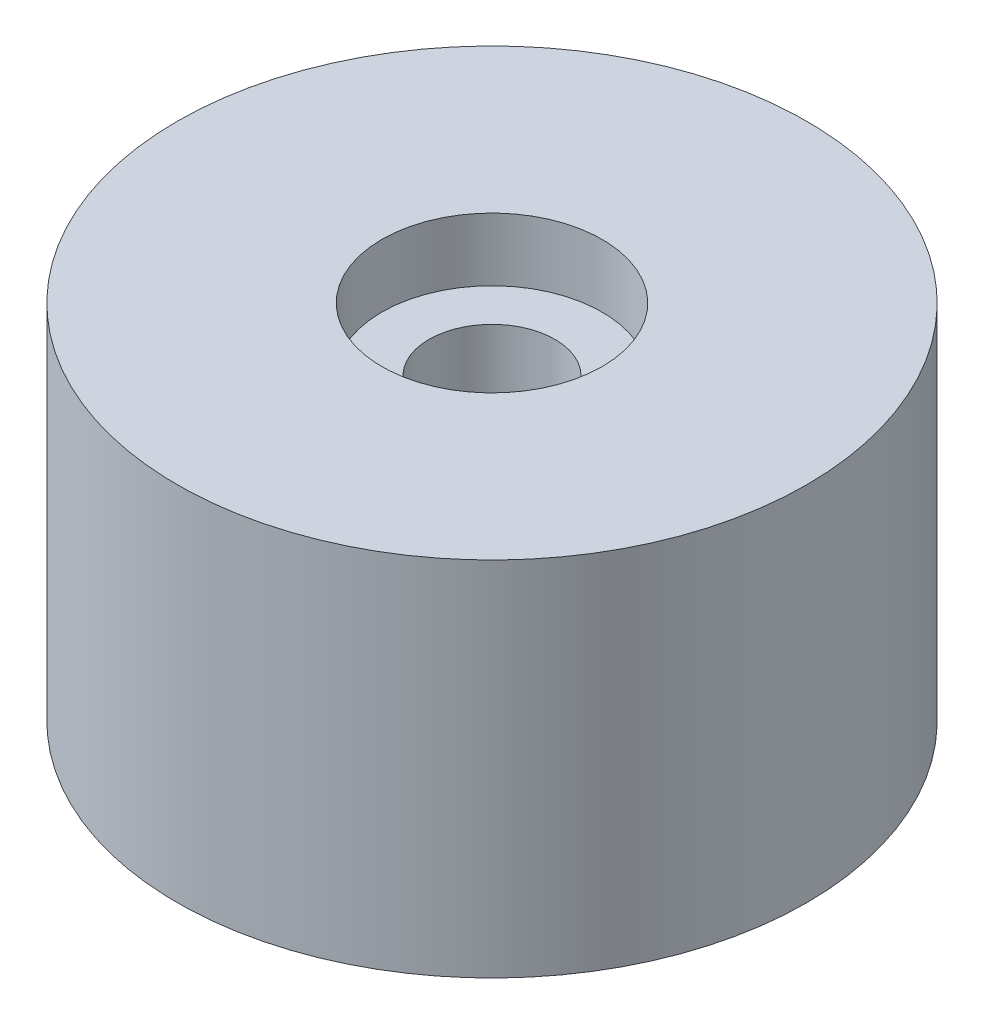
ISO-10303-21;
HEADER;
FILE_DESCRIPTION(('STEP AP214'),'2;1');
FILE_NAME('part.step','',(''),(''),'','','');
FILE_SCHEMA(('AUTOMOTIVE_DESIGN { 1 0 10303 214 1 1 1 1 }'));
ENDSEC;
DATA;
#1=APPLICATION_CONTEXT('core data for automotive mechanical design processes');
#2=APPLICATION_PROTOCOL_DEFINITION('international standard','automotive_design',2000,#1);
#3=PRODUCT_CONTEXT('',#1,'mechanical');
#4=PRODUCT('Part','Part','',(#3));
#5=PRODUCT_RELATED_PRODUCT_CATEGORY('part','',(#4));
#6=PRODUCT_DEFINITION_FORMATION('','',#4);
#7=PRODUCT_DEFINITION_CONTEXT('part definition',#1,'design');
#8=PRODUCT_DEFINITION('design','',#6,#7);
#9=PRODUCT_DEFINITION_SHAPE('','',#8);
#10=(LENGTH_UNIT() NAMED_UNIT(*) SI_UNIT(.MILLI.,.METRE.));
#11=(NAMED_UNIT(*) PLANE_ANGLE_UNIT() SI_UNIT($,.RADIAN.));
#12=(NAMED_UNIT(*) SI_UNIT($,.STERADIAN.) SOLID_ANGLE_UNIT());
#13=UNCERTAINTY_MEASURE_WITH_UNIT(LENGTH_MEASURE(1.E-05),#10,'distance_accuracy_value','');
#14=(GEOMETRIC_REPRESENTATION_CONTEXT(3) GLOBAL_UNCERTAINTY_ASSIGNED_CONTEXT((#13)) GLOBAL_UNIT_ASSIGNED_CONTEXT((#10,
#11,#12)) REPRESENTATION_CONTEXT('',''));
#15=CARTESIAN_POINT('',(0.,0.,0.));
#16=DIRECTION('',(0.,0.,1.));
#17=DIRECTION('',(1.,0.,0.));
#18=AXIS2_PLACEMENT_3D('',#15,#16,#17);
#19=CARTESIAN_POINT('',(0.,0.,0.));
#20=DIRECTION('',(0.,1.,0.));
#21=DIRECTION('',(-1.,0.,0.));
#22=AXIS2_PLACEMENT_3D('',#19,#20,#21);
#23=PLANE('',#22);
#24=CARTESIAN_POINT('',(0.,0.,0.));
#25=DIRECTION('',(0.,1.,0.));
#26=DIRECTION('',(-1.,0.,0.));
#27=AXIS2_PLACEMENT_3D('',#24,#25,#26);
#28=CIRCLE('',#27,20.);
#29=CARTESIAN_POINT('',(-20.,0.,0.));
#30=VERTEX_POINT('',#29);
#31=EDGE_CURVE('E10',#30,#30,#28,.T.);
#32=ORIENTED_EDGE('',*,*,#31,.F.);
#33=EDGE_LOOP('',(#32));
#34=FACE_BOUND('',#33,.T.);
#35=ADVANCED_FACE('F31',(#34),#23,.F.);
#36=CARTESIAN_POINT('',(0.,3.,0.));
#37=DIRECTION('',(0.,1.,0.));
#38=DIRECTION('',(-1.,0.,0.));
#39=AXIS2_PLACEMENT_3D('',#36,#37,#38);
#40=CYLINDRICAL_SURFACE('',#39,20.);
#41=CARTESIAN_POINT('',(0.,23.,0.));
#42=DIRECTION('',(0.,1.,0.));
#43=DIRECTION('',(-1.,0.,0.));
#44=AXIS2_PLACEMENT_3D('',#41,#42,#43);
#45=CIRCLE('',#44,20.);
#46=CARTESIAN_POINT('',(-20.,23.,0.));
#47=VERTEX_POINT('',#46);
#48=EDGE_CURVE('E37',#47,#47,#45,.T.);
#49=ORIENTED_EDGE('',*,*,#48,.F.);
#50=EDGE_LOOP('',(#49));
#51=FACE_BOUND('',#50,.T.);
#52=ORIENTED_EDGE('',*,*,#31,.T.);
#53=EDGE_LOOP('',(#52));
#54=FACE_BOUND('',#53,.T.);
#55=ADVANCED_FACE('F79',(#51,#54),#40,.T.);
#56=CARTESIAN_POINT('',(20.,23.,0.));
#57=DIRECTION('',(0.,-1.,0.));
#58=DIRECTION('',(1.,0.,0.));
#59=AXIS2_PLACEMENT_3D('',#56,#57,#58);
#60=PLANE('',#59);
#61=CARTESIAN_POINT('',(0.,23.,0.));
#62=DIRECTION('',(0.,1.,0.));
#63=DIRECTION('',(-1.,0.,0.));
#64=AXIS2_PLACEMENT_3D('',#61,#62,#63);
#65=CIRCLE('',#64,7.);
#66=CARTESIAN_POINT('',(-6.99999999999999,23.,0.));
#67=VERTEX_POINT('',#66);
#68=EDGE_CURVE('E41',#67,#67,#65,.T.);
#69=ORIENTED_EDGE('',*,*,#68,.F.);
#70=EDGE_LOOP('',(#69));
#71=FACE_BOUND('',#70,.T.);
#72=ORIENTED_EDGE('',*,*,#48,.T.);
#73=EDGE_LOOP('',(#72));
#74=FACE_BOUND('',#73,.T.);
#75=ADVANCED_FACE('F74',(#71,#74),#60,.F.);
#76=CARTESIAN_POINT('',(0.,3.,0.));
#77=DIRECTION('',(0.,1.,0.));
#78=DIRECTION('',(-1.,0.,0.));
#79=AXIS2_PLACEMENT_3D('',#76,#77,#78);
#80=CYLINDRICAL_SURFACE('',#79,7.);
#81=CARTESIAN_POINT('',(0.,19.,0.));
#82=DIRECTION('',(0.,1.,0.));
#83=DIRECTION('',(-1.,0.,0.));
#84=AXIS2_PLACEMENT_3D('',#81,#82,#83);
#85=CIRCLE('',#84,7.);
#86=CARTESIAN_POINT('',(-7.,19.,0.));
#87=VERTEX_POINT('',#86);
#88=EDGE_CURVE('E45',#87,#87,#85,.T.);
#89=ORIENTED_EDGE('',*,*,#88,.F.);
#90=EDGE_LOOP('',(#89));
#91=FACE_BOUND('',#90,.T.);
#92=ORIENTED_EDGE('',*,*,#68,.T.);
#93=EDGE_LOOP('',(#92));
#94=FACE_BOUND('',#93,.T.);
#95=ADVANCED_FACE('F68',(#91,#94),#80,.F.);
#96=CARTESIAN_POINT('',(7.,19.,0.));
#97=DIRECTION('',(0.,-1.,0.));
#98=DIRECTION('',(1.,0.,0.));
#99=AXIS2_PLACEMENT_3D('',#96,#97,#98);
#100=PLANE('',#99);
#101=CARTESIAN_POINT('',(0.,19.,0.));
#102=DIRECTION('',(0.,1.,0.));
#103=DIRECTION('',(-1.,0.,0.));
#104=AXIS2_PLACEMENT_3D('',#101,#102,#103);
#105=CIRCLE('',#104,4.);
#106=CARTESIAN_POINT('',(-3.99999999999999,19.,0.));
#107=VERTEX_POINT('',#106);
#108=EDGE_CURVE('E50',#107,#107,#105,.T.);
#109=ORIENTED_EDGE('',*,*,#108,.F.);
#110=EDGE_LOOP('',(#109));
#111=FACE_BOUND('',#110,.T.);
#112=ORIENTED_EDGE('',*,*,#88,.T.);
#113=EDGE_LOOP('',(#112));
#114=FACE_BOUND('',#113,.T.);
#115=ADVANCED_FACE('F62',(#111,#114),#100,.F.);
#116=CARTESIAN_POINT('',(0.,3.,0.));
#117=DIRECTION('',(0.,1.,0.));
#118=DIRECTION('',(-1.,0.,0.));
#119=AXIS2_PLACEMENT_3D('',#116,#117,#118);
#120=CYLINDRICAL_SURFACE('',#119,4.);
#121=CARTESIAN_POINT('',(0.,3.,0.));
#122=DIRECTION('',(0.,1.,0.));
#123=DIRECTION('',(-1.,0.,0.));
#124=AXIS2_PLACEMENT_3D('',#121,#122,#123);
#125=CIRCLE('',#124,4.);
#126=CARTESIAN_POINT('',(-4.,3.,0.));
#127=VERTEX_POINT('',#126);
#128=EDGE_CURVE('E53',#127,#127,#125,.T.);
#129=ORIENTED_EDGE('',*,*,#128,.F.);
#130=EDGE_LOOP('',(#129));
#131=FACE_BOUND('',#130,.T.);
#132=ORIENTED_EDGE('',*,*,#108,.T.);
#133=EDGE_LOOP('',(#132));
#134=FACE_BOUND('',#133,.T.);
#135=ADVANCED_FACE('F59',(#131,#134),#120,.F.);
#136=CARTESIAN_POINT('',(4.,3.,0.));
#137=DIRECTION('',(0.,-1.,0.));
#138=DIRECTION('',(1.,0.,0.));
#139=AXIS2_PLACEMENT_3D('',#136,#137,#138);
#140=PLANE('',#139);
#141=ORIENTED_EDGE('',*,*,#128,.T.);
#142=EDGE_LOOP('',(#141));
#143=FACE_BOUND('',#142,.T.);
#144=ADVANCED_FACE('F57',(#143),#140,.F.);
#145=CLOSED_SHELL('',(#35,#55,#75,#95,#115,#135,#144));
#146=MANIFOLD_SOLID_BREP('B2',#145);
#147=ADVANCED_BREP_SHAPE_REPRESENTATION('',(#18,#146),#14);
#148=SHAPE_DEFINITION_REPRESENTATION(#9,#147);
ENDSEC;
END-ISO-10303-21;
